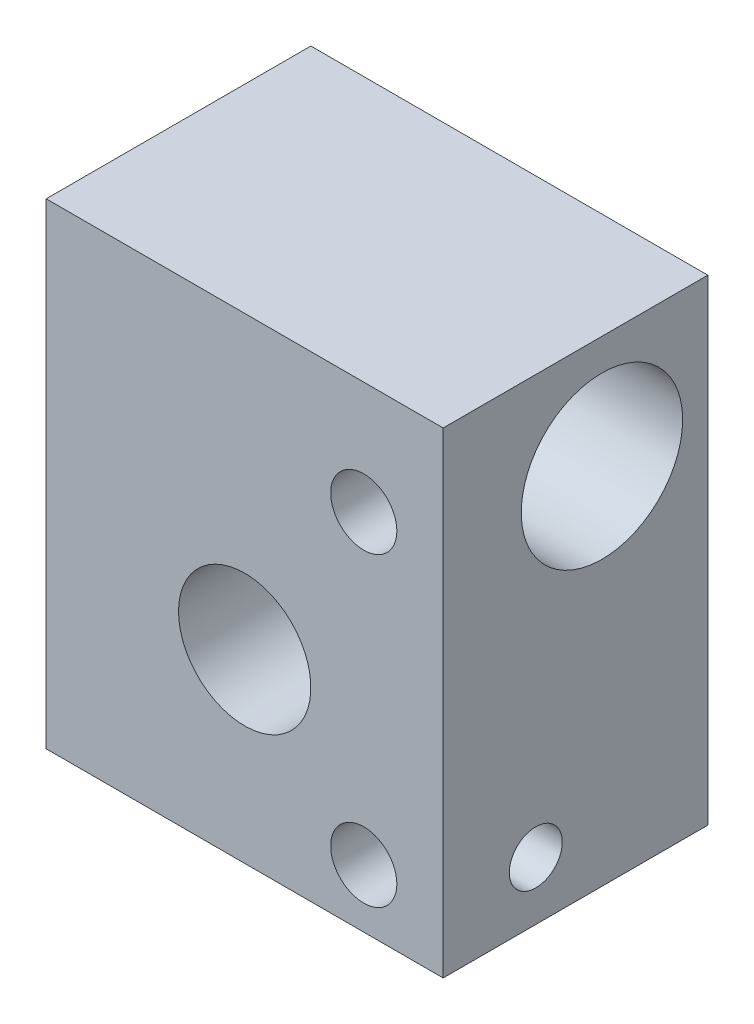
ISO-10303-21;
HEADER;
FILE_DESCRIPTION(('STEP AP214'),'2;1');
FILE_NAME('part.step','',(''),(''),'','','');
FILE_SCHEMA(('AUTOMOTIVE_DESIGN { 1 0 10303 214 1 1 1 1 }'));
ENDSEC;
DATA;
#1=APPLICATION_CONTEXT('core data for automotive mechanical design processes');
#2=APPLICATION_PROTOCOL_DEFINITION('international standard','automotive_design',2000,#1);
#3=PRODUCT_CONTEXT('',#1,'mechanical');
#4=PRODUCT('Part','Part','',(#3));
#5=PRODUCT_RELATED_PRODUCT_CATEGORY('part','',(#4));
#6=PRODUCT_DEFINITION_FORMATION('','',#4);
#7=PRODUCT_DEFINITION_CONTEXT('part definition',#1,'design');
#8=PRODUCT_DEFINITION('design','',#6,#7);
#9=PRODUCT_DEFINITION_SHAPE('','',#8);
#10=(LENGTH_UNIT() NAMED_UNIT(*) SI_UNIT(.MILLI.,.METRE.));
#11=(NAMED_UNIT(*) PLANE_ANGLE_UNIT() SI_UNIT($,.RADIAN.));
#12=(NAMED_UNIT(*) SI_UNIT($,.STERADIAN.) SOLID_ANGLE_UNIT());
#13=UNCERTAINTY_MEASURE_WITH_UNIT(LENGTH_MEASURE(1.E-05),#10,'distance_accuracy_value','');
#14=(GEOMETRIC_REPRESENTATION_CONTEXT(3) GLOBAL_UNCERTAINTY_ASSIGNED_CONTEXT((#13)) GLOBAL_UNIT_ASSIGNED_CONTEXT((#10,
#11,#12)) REPRESENTATION_CONTEXT('',''));
#15=CARTESIAN_POINT('',(0.,0.,0.));
#16=DIRECTION('',(0.,0.,1.));
#17=DIRECTION('',(1.,0.,0.));
#18=AXIS2_PLACEMENT_3D('',#15,#16,#17);
#19=CARTESIAN_POINT('',(7.5,-9.,10.));
#20=DIRECTION('',(-1.,0.,0.));
#21=DIRECTION('',(0.,0.,1.));
#22=AXIS2_PLACEMENT_3D('',#19,#20,#21);
#23=PLANE('',#22);
#24=CARTESIAN_POINT('',(7.5,-6.8,6.5));
#25=DIRECTION('',(1.,0.,0.));
#26=DIRECTION('',(0.,0.,-1.));
#27=AXIS2_PLACEMENT_3D('',#24,#25,#26);
#28=CIRCLE('',#27,0.999999999999998);
#29=CARTESIAN_POINT('',(7.5,-6.8,5.5));
#30=VERTEX_POINT('',#29);
#31=EDGE_CURVE('E122',#30,#30,#28,.T.);
#32=ORIENTED_EDGE('',*,*,#31,.F.);
#33=EDGE_LOOP('',(#32));
#34=FACE_BOUND('',#33,.T.);
#35=CARTESIAN_POINT('',(7.5,4.75,4.));
#36=DIRECTION('',(1.,0.,0.));
#37=DIRECTION('',(0.,0.,-1.));
#38=AXIS2_PLACEMENT_3D('',#35,#36,#37);
#39=CIRCLE('',#38,3.05);
#40=CARTESIAN_POINT('',(7.5,4.75,0.950000000000001));
#41=VERTEX_POINT('',#40);
#42=EDGE_CURVE('E243',#41,#41,#39,.T.);
#43=ORIENTED_EDGE('',*,*,#42,.F.);
#44=EDGE_LOOP('',(#43));
#45=FACE_BOUND('',#44,.T.);
#46=DIRECTION('',(0.,1.,0.));
#47=VECTOR('',#46,1.);
#48=CARTESIAN_POINT('',(7.5,-9.,0.));
#49=LINE('',#48,#47);
#50=CARTESIAN_POINT('',(7.5,-9.,0.));
#51=VERTEX_POINT('',#50);
#52=CARTESIAN_POINT('',(7.5,9.,0.));
#53=VERTEX_POINT('',#52);
#54=EDGE_CURVE('E204',#51,#53,#49,.T.);
#55=ORIENTED_EDGE('',*,*,#54,.T.);
#56=DIRECTION('',(0.,0.,-1.));
#57=VECTOR('',#56,1.);
#58=CARTESIAN_POINT('',(7.5,9.,10.));
#59=LINE('',#58,#57);
#60=CARTESIAN_POINT('',(7.5,9.,10.));
#61=VERTEX_POINT('',#60);
#62=EDGE_CURVE('E150',#61,#53,#59,.T.);
#63=ORIENTED_EDGE('',*,*,#62,.F.);
#64=DIRECTION('',(0.,1.,0.));
#65=VECTOR('',#64,1.);
#66=CARTESIAN_POINT('',(7.5,-9.,10.));
#67=LINE('',#66,#65);
#68=CARTESIAN_POINT('',(7.5,-9.,10.));
#69=VERTEX_POINT('',#68);
#70=EDGE_CURVE('E215',#69,#61,#67,.T.);
#71=ORIENTED_EDGE('',*,*,#70,.F.);
#72=DIRECTION('',(0.,0.,-1.));
#73=VECTOR('',#72,1.);
#74=CARTESIAN_POINT('',(7.5,-9.,10.));
#75=LINE('',#74,#73);
#76=EDGE_CURVE('E219',#69,#51,#75,.T.);
#77=ORIENTED_EDGE('',*,*,#76,.T.);
#78=EDGE_LOOP('',(#55,#63,#71,#77));
#79=FACE_BOUND('',#78,.T.);
#80=ADVANCED_FACE('F52',(#34,#45,#79),#23,.F.);
#81=CARTESIAN_POINT('',(-7.5,9.,10.));
#82=DIRECTION('',(0.,-1.,0.));
#83=DIRECTION('',(0.,0.,-1.));
#84=AXIS2_PLACEMENT_3D('',#81,#82,#83);
#85=PLANE('',#84);
#86=DIRECTION('',(-1.,0.,0.));
#87=VECTOR('',#86,1.);
#88=CARTESIAN_POINT('',(-7.5,9.,0.));
#89=LINE('',#88,#87);
#90=CARTESIAN_POINT('',(-7.5,9.,0.));
#91=VERTEX_POINT('',#90);
#92=EDGE_CURVE('E194',#53,#91,#89,.T.);
#93=ORIENTED_EDGE('',*,*,#92,.T.);
#94=DIRECTION('',(0.,0.,-1.));
#95=VECTOR('',#94,1.);
#96=CARTESIAN_POINT('',(-7.5,9.,10.));
#97=LINE('',#96,#95);
#98=CARTESIAN_POINT('',(-7.5,9.,10.));
#99=VERTEX_POINT('',#98);
#100=EDGE_CURVE('E196',#99,#91,#97,.T.);
#101=ORIENTED_EDGE('',*,*,#100,.F.);
#102=DIRECTION('',(-1.,0.,0.));
#103=VECTOR('',#102,1.);
#104=CARTESIAN_POINT('',(-7.5,9.,10.));
#105=LINE('',#104,#103);
#106=EDGE_CURVE('E229',#61,#99,#105,.T.);
#107=ORIENTED_EDGE('',*,*,#106,.F.);
#108=ORIENTED_EDGE('',*,*,#62,.T.);
#109=EDGE_LOOP('',(#93,#101,#107,#108));
#110=FACE_BOUND('',#109,.T.);
#111=ADVANCED_FACE('F184',(#110),#85,.F.);
#112=CARTESIAN_POINT('',(-7.5,-9.,10.));
#113=DIRECTION('',(1.,0.,0.));
#114=DIRECTION('',(0.,0.,-1.));
#115=AXIS2_PLACEMENT_3D('',#112,#113,#114);
#116=PLANE('',#115);
#117=CARTESIAN_POINT('',(-7.5,4.75,4.));
#118=DIRECTION('',(1.,0.,0.));
#119=DIRECTION('',(0.,0.,-1.));
#120=AXIS2_PLACEMENT_3D('',#117,#118,#119);
#121=CIRCLE('',#120,3.05);
#122=CARTESIAN_POINT('',(-7.5,4.75,0.950000000000001));
#123=VERTEX_POINT('',#122);
#124=EDGE_CURVE('E240',#123,#123,#121,.T.);
#125=ORIENTED_EDGE('',*,*,#124,.T.);
#126=EDGE_LOOP('',(#125));
#127=FACE_BOUND('',#126,.T.);
#128=DIRECTION('',(0.,-1.,0.));
#129=VECTOR('',#128,1.);
#130=CARTESIAN_POINT('',(-7.5,-9.,0.));
#131=LINE('',#130,#129);
#132=CARTESIAN_POINT('',(-7.5,-9.,0.));
#133=VERTEX_POINT('',#132);
#134=EDGE_CURVE('E203',#91,#133,#131,.T.);
#135=ORIENTED_EDGE('',*,*,#134,.T.);
#136=DIRECTION('',(0.,0.,-1.));
#137=VECTOR('',#136,1.);
#138=CARTESIAN_POINT('',(-7.5,-9.,10.));
#139=LINE('',#138,#137);
#140=CARTESIAN_POINT('',(-7.5,-9.,10.));
#141=VERTEX_POINT('',#140);
#142=EDGE_CURVE('E210',#141,#133,#139,.T.);
#143=ORIENTED_EDGE('',*,*,#142,.F.);
#144=DIRECTION('',(0.,-1.,0.));
#145=VECTOR('',#144,1.);
#146=CARTESIAN_POINT('',(-7.5,-9.,10.));
#147=LINE('',#146,#145);
#148=EDGE_CURVE('E209',#99,#141,#147,.T.);
#149=ORIENTED_EDGE('',*,*,#148,.F.);
#150=ORIENTED_EDGE('',*,*,#100,.T.);
#151=EDGE_LOOP('',(#135,#143,#149,#150));
#152=FACE_BOUND('',#151,.T.);
#153=ADVANCED_FACE('F181',(#127,#152),#116,.F.);
#154=CARTESIAN_POINT('',(-7.5,-9.,10.));
#155=DIRECTION('',(0.,1.,0.));
#156=DIRECTION('',(0.,0.,1.));
#157=AXIS2_PLACEMENT_3D('',#154,#155,#156);
#158=PLANE('',#157);
#159=DIRECTION('',(1.,0.,0.));
#160=VECTOR('',#159,1.);
#161=CARTESIAN_POINT('',(-7.5,-9.,0.));
#162=LINE('',#161,#160);
#163=EDGE_CURVE('E213',#133,#51,#162,.T.);
#164=ORIENTED_EDGE('',*,*,#163,.T.);
#165=ORIENTED_EDGE('',*,*,#76,.F.);
#166=DIRECTION('',(1.,0.,0.));
#167=VECTOR('',#166,1.);
#168=CARTESIAN_POINT('',(-7.5,-9.,10.));
#169=LINE('',#168,#167);
#170=EDGE_CURVE('E222',#141,#69,#169,.T.);
#171=ORIENTED_EDGE('',*,*,#170,.F.);
#172=ORIENTED_EDGE('',*,*,#142,.T.);
#173=EDGE_LOOP('',(#164,#165,#171,#172));
#174=FACE_BOUND('',#173,.T.);
#175=ADVANCED_FACE('F174',(#174),#158,.F.);
#176=CARTESIAN_POINT('',(0.,0.,10.));
#177=DIRECTION('',(0.,0.,-1.));
#178=DIRECTION('',(-1.,0.,0.));
#179=AXIS2_PLACEMENT_3D('',#176,#177,#178);
#180=PLANE('',#179);
#181=CARTESIAN_POINT('',(4.5,4.75,10.));
#182=DIRECTION('',(0.,0.,1.));
#183=DIRECTION('',(1.,0.,0.));
#184=AXIS2_PLACEMENT_3D('',#181,#182,#183);
#185=CIRCLE('',#184,1.24999999999999);
#186=CARTESIAN_POINT('',(5.74999999999999,4.75,10.));
#187=VERTEX_POINT('',#186);
#188=EDGE_CURVE('E255',#187,#187,#185,.T.);
#189=ORIENTED_EDGE('',*,*,#188,.F.);
#190=EDGE_LOOP('',(#189));
#191=FACE_BOUND('',#190,.T.);
#192=CARTESIAN_POINT('',(4.5,-6.8,10.));
#193=DIRECTION('',(0.,0.,1.));
#194=DIRECTION('',(1.,0.,0.));
#195=AXIS2_PLACEMENT_3D('',#192,#193,#194);
#196=CIRCLE('',#195,1.24999999999999);
#197=CARTESIAN_POINT('',(5.74999999999999,-6.8,10.));
#198=VERTEX_POINT('',#197);
#199=EDGE_CURVE('E253',#198,#198,#196,.T.);
#200=ORIENTED_EDGE('',*,*,#199,.F.);
#201=EDGE_LOOP('',(#200));
#202=FACE_BOUND('',#201,.T.);
#203=CARTESIAN_POINT('',(0.,-2.,10.));
#204=DIRECTION('',(0.,0.,-1.));
#205=DIRECTION('',(-1.,0.,0.));
#206=AXIS2_PLACEMENT_3D('',#203,#204,#205);
#207=CIRCLE('',#206,2.5);
#208=CARTESIAN_POINT('',(-2.5,-2.,10.));
#209=VERTEX_POINT('',#208);
#210=EDGE_CURVE('E232',#209,#209,#207,.T.);
#211=ORIENTED_EDGE('',*,*,#210,.T.);
#212=EDGE_LOOP('',(#211));
#213=FACE_BOUND('',#212,.T.);
#214=ORIENTED_EDGE('',*,*,#70,.T.);
#215=ORIENTED_EDGE('',*,*,#106,.T.);
#216=ORIENTED_EDGE('',*,*,#148,.T.);
#217=ORIENTED_EDGE('',*,*,#170,.T.);
#218=EDGE_LOOP('',(#214,#215,#216,#217));
#219=FACE_BOUND('',#218,.T.);
#220=ADVANCED_FACE('F171',(#191,#202,#213,#219),#180,.F.);
#221=CARTESIAN_POINT('',(0.,0.,0.));
#222=DIRECTION('',(0.,0.,-1.));
#223=DIRECTION('',(-1.,0.,0.));
#224=AXIS2_PLACEMENT_3D('',#221,#222,#223);
#225=PLANE('',#224);
#226=CARTESIAN_POINT('',(0.,-2.,0.));
#227=DIRECTION('',(0.,0.,-1.));
#228=DIRECTION('',(-1.,0.,0.));
#229=AXIS2_PLACEMENT_3D('',#226,#227,#228);
#230=CIRCLE('',#229,2.5);
#231=CARTESIAN_POINT('',(-2.5,-2.,0.));
#232=VERTEX_POINT('',#231);
#233=EDGE_CURVE('E235',#232,#232,#230,.T.);
#234=ORIENTED_EDGE('',*,*,#233,.F.);
#235=EDGE_LOOP('',(#234));
#236=FACE_BOUND('',#235,.T.);
#237=ORIENTED_EDGE('',*,*,#54,.F.);
#238=ORIENTED_EDGE('',*,*,#163,.F.);
#239=ORIENTED_EDGE('',*,*,#134,.F.);
#240=ORIENTED_EDGE('',*,*,#92,.F.);
#241=EDGE_LOOP('',(#237,#238,#239,#240));
#242=FACE_BOUND('',#241,.T.);
#243=ADVANCED_FACE('F169',(#236,#242),#225,.T.);
#244=CARTESIAN_POINT('',(0.,-2.,10.));
#245=DIRECTION('',(0.,0.,-1.));
#246=DIRECTION('',(-1.,0.,0.));
#247=AXIS2_PLACEMENT_3D('',#244,#245,#246);
#248=CYLINDRICAL_SURFACE('',#247,2.5);
#249=ORIENTED_EDGE('',*,*,#210,.F.);
#250=EDGE_LOOP('',(#249));
#251=FACE_BOUND('',#250,.T.);
#252=ORIENTED_EDGE('',*,*,#233,.T.);
#253=EDGE_LOOP('',(#252));
#254=FACE_BOUND('',#253,.T.);
#255=ADVANCED_FACE('F165',(#251,#254),#248,.F.);
#256=CARTESIAN_POINT('',(-7.5,4.75,4.));
#257=DIRECTION('',(1.,0.,0.));
#258=DIRECTION('',(0.,0.,-1.));
#259=AXIS2_PLACEMENT_3D('',#256,#257,#258);
#260=CYLINDRICAL_SURFACE('',#259,3.05);
#261=CARTESIAN_POINT('',(5.74999999999999,4.75,7.05));
#262=CARTESIAN_POINT('',(5.74999317358084,4.81705105449435,7.0499949013604));
#263=CARTESIAN_POINT('',(5.7445728904159,4.88421220939516,7.04776316601173));
#264=CARTESIAN_POINT('',(5.7230821427269,5.01663531512961,7.03905220749816));
#265=CARTESIAN_POINT('',(5.7069833965083,5.08189174087961,7.0325617055695));
#266=CARTESIAN_POINT('',(5.66482596800735,5.20837429284752,7.01603149034563));
#267=CARTESIAN_POINT('',(5.63880056530878,5.2696130929358,7.00600364451595));
#268=CARTESIAN_POINT('',(5.57766372514542,5.38679775394015,6.98337979201622));
#269=CARTESIAN_POINT('',(5.54255520538643,5.44274530666015,6.97078461030852));
#270=CARTESIAN_POINT('',(5.46243359833868,5.55058268229026,6.94360272183732));
#271=CARTESIAN_POINT('',(5.41704813784625,5.60217961883631,6.92895218720805));
#272=CARTESIAN_POINT('',(5.31844769395315,5.69727980579278,6.8995935820288));
#273=CARTESIAN_POINT('',(5.26522873562099,5.74077892161812,6.88488548598071));
#274=CARTESIAN_POINT('',(5.1494220879687,5.82047635819198,6.85630174305004));
#275=CARTESIAN_POINT('',(5.08651058665788,5.85623272255294,6.84249824263373));
#276=CARTESIAN_POINT('',(4.95491722684178,5.91652509902148,6.81829427065235));
#277=CARTESIAN_POINT('',(4.88623826542879,5.9410667050528,6.80789210323986));
#278=CARTESIAN_POINT('',(4.74842884283273,5.977033698322,6.79235707938262));
#279=CARTESIAN_POINT('',(4.67947149284317,5.98902161527503,6.78699943260884));
#280=CARTESIAN_POINT('',(4.54033187566907,6.00129693566521,6.78151145539133));
#281=CARTESIAN_POINT('',(4.47015027248522,6.00159049579919,6.78137837438494));
#282=CARTESIAN_POINT('',(4.33607409840986,5.99089353762405,6.78616368996563));
#283=CARTESIAN_POINT('',(4.27209740726591,5.98073314256808,6.79071047916049));
#284=CARTESIAN_POINT('',(4.14685271703793,5.95080567936669,6.80371701324258));
#285=CARTESIAN_POINT('',(4.08558521945647,5.93103684064336,6.81217747930138));
#286=CARTESIAN_POINT('',(3.96597856734735,5.88207159424284,6.83224715740189));
#287=CARTESIAN_POINT('',(3.90772757534972,5.85268647565431,6.84391858333761));
#288=CARTESIAN_POINT('',(3.79676189319712,5.78545581744839,6.8690795378448));
#289=CARTESIAN_POINT('',(3.74404935655718,5.7476070046597,6.88256976900067));
#290=CARTESIAN_POINT('',(3.64113506271575,5.66089979031177,6.91118669367846));
#291=CARTESIAN_POINT('',(3.59148817119212,5.61139546177047,6.92635714795841));
#292=CARTESIAN_POINT('',(3.50101833818234,5.50460843164101,6.95569448523891));
#293=CARTESIAN_POINT('',(3.46019733238115,5.44732402821036,6.96986114763168));
#294=CARTESIAN_POINT('',(3.38776019476994,5.32496342854657,6.99598214323011));
#295=CARTESIAN_POINT('',(3.35636271935724,5.25974527572702,7.00788187819974));
#296=CARTESIAN_POINT('',(3.30517803112997,5.12434088842293,7.02771185130719));
#297=CARTESIAN_POINT('',(3.28538461664024,5.05415733016857,7.03564420943661));
#298=CARTESIAN_POINT('',(3.25911499785756,4.91545720041041,7.04625363825052));
#299=CARTESIAN_POINT('',(3.25189372784432,4.84710415103708,7.04922426910946));
#300=CARTESIAN_POINT('',(3.24876092149755,4.71010441371817,7.0505074612745));
#301=CARTESIAN_POINT('',(3.25284627086616,4.64145781182913,7.04882130524732));
#302=CARTESIAN_POINT('',(3.27167121733155,4.50926209998629,7.04117156509262));
#303=CARTESIAN_POINT('',(3.28589367478943,4.44562598291882,7.03541570476584));
#304=CARTESIAN_POINT('',(3.32387605471634,4.32170816248345,7.02042451329165));
#305=CARTESIAN_POINT('',(3.34763719121059,4.26142688721188,7.01118873925112));
#306=CARTESIAN_POINT('',(3.40479928404273,4.14383011012163,6.98977295322551));
#307=CARTESIAN_POINT('',(3.43847544195124,4.08666382302296,6.97751077732146));
#308=CARTESIAN_POINT('',(3.51420811639302,3.97859041874229,6.95135965585715));
#309=CARTESIAN_POINT('',(3.55626807827196,3.92768588879936,6.93747004246777));
#310=CARTESIAN_POINT('',(3.65098440399942,3.82987991098666,6.9083776173988));
#311=CARTESIAN_POINT('',(3.70417275944046,3.78349954211682,6.89315046142814));
#312=CARTESIAN_POINT('',(3.81783195761042,3.70018452435906,6.86397295744693));
#313=CARTESIAN_POINT('',(3.87830425548019,3.66325176747518,6.85002286554325));
#314=CARTESIAN_POINT('',(4.00591935720062,3.59955272757804,6.82491824303052));
#315=CARTESIAN_POINT('',(4.0731350035576,3.57291696039833,6.8138001745101));
#316=CARTESIAN_POINT('',(4.21169404128461,3.53156002386075,6.79614362783963));
#317=CARTESIAN_POINT('',(4.28303413036749,3.51682946022231,6.78960153937764));
#318=CARTESIAN_POINT('',(4.42205571719578,3.50061997017984,6.78237686582237));
#319=CARTESIAN_POINT('',(4.48961071540186,3.49823064874135,6.78129189039514));
#320=CARTESIAN_POINT('',(4.62411541510115,3.50435741732201,6.78404131006805));
#321=CARTESIAN_POINT('',(4.6910652011546,3.51287195937366,6.7878750068888));
#322=CARTESIAN_POINT('',(4.8194595845332,3.53980857539514,6.79966724973414));
#323=CARTESIAN_POINT('',(4.88101694579431,3.55778270632242,6.80743875303861));
#324=CARTESIAN_POINT('',(5.00026093044537,3.60269826055876,6.82609039777681));
#325=CARTESIAN_POINT('',(5.0579464682445,3.62964218632339,6.83697140660187));
#326=CARTESIAN_POINT('',(5.17152052867124,3.69356546820026,6.86141244323642));
#327=CARTESIAN_POINT('',(5.22710231558399,3.73104304994741,6.87509264152988));
#328=CARTESIAN_POINT('',(5.33147333634056,3.81425954659735,6.90324259102355));
#329=CARTESIAN_POINT('',(5.38026033074679,3.8600011738197,6.91771260035406));
#330=CARTESIAN_POINT('',(5.47314082024466,3.96222488066987,6.94701985281455));
#331=CARTESIAN_POINT('',(5.51667265144533,4.0192324065468,6.961812751821));
#332=CARTESIAN_POINT('',(5.59357367951555,4.14029737005191,6.98908126299053));
#333=CARTESIAN_POINT('',(5.6269382146159,4.20435802331352,7.00155581115557));
#334=CARTESIAN_POINT('',(5.68180811191665,4.33663629870453,7.02258806460315));
#335=CARTESIAN_POINT('',(5.70351052450805,4.40476171520484,7.03121040731175));
#336=CARTESIAN_POINT('',(5.73495872650017,4.54399616753341,7.04383134859934));
#337=CARTESIAN_POINT('',(5.74474216568277,4.61509507070934,7.04784450441534));
#338=CARTESIAN_POINT('',(5.74946289651355,4.70760124338892,7.04978053015449));
#339=CARTESIAN_POINT('',(5.75000215885384,4.72879511590617,7.05000161244387));
#340=CARTESIAN_POINT('',(5.74999999999999,4.75,7.05));
#341=B_SPLINE_CURVE_WITH_KNOTS('',3,(#261,#262,#263,#264,#265,#266,#267,#268,#269,#270,#271,
#272,#273,#274,#275,#276,#277,#278,#279,#280,#281,#282,#283,#284,#285,#286,#287,#288,#289,#290,
#291,#292,#293,#294,#295,#296,#297,#298,#299,#300,#301,#302,#303,#304,#305,#306,#307,#308,#309,
#310,#311,#312,#313,#314,#315,#316,#317,#318,#319,#320,#321,#322,#323,#324,#325,#326,#327,#328,
#329,#330,#331,#332,#333,#334,#335,#336,#337,#338,#339,#340),.UNSPECIFIED.,.T.,.F.,(4,2,2,2,2,2,
2,2,2,2,2,2,2,2,2,2,2,2,2,2,2,2,2,2,2,2,2,2,2,2,2,2,2,2,2,2,2,2,2,4),(0.,0.201094311180327,
0.402723354574274,0.60368228554281,0.804576743863707,1.01444492091329,1.22441996030868,
1.44431409976959,1.66409843594336,1.87354721803841,2.08288573073389,2.27679448285735,
2.47073898070664,2.66874390795883,2.86682554265503,3.08105274490332,3.29532688370776,
3.51424468844056,3.73304538781654,3.93837132545348,4.14364071369572,4.33912550528581,
4.53463518488672,4.73618655641969,4.93782092740471,5.15341391236424,5.36905003881043,
5.58733616568886,5.80544987646513,6.00721727204662,6.20895602688514,6.40190297186301,
6.59490379169176,6.79928960640031,7.00374262427848,7.22240178249367,7.44116104698124,
7.65609749208749,7.87035321839582,7.93394925864703),.UNSPECIFIED.);
#342=CARTESIAN_POINT('',(5.74999999999999,4.75,7.05));
#343=VERTEX_POINT('',#342);
#344=EDGE_CURVE('E151',#343,#343,#341,.T.);
#345=ORIENTED_EDGE('',*,*,#344,.T.);
#346=EDGE_LOOP('',(#345));
#347=FACE_BOUND('',#346,.T.);
#348=ORIENTED_EDGE('',*,*,#124,.F.);
#349=EDGE_LOOP('',(#348));
#350=FACE_BOUND('',#349,.T.);
#351=ORIENTED_EDGE('',*,*,#42,.T.);
#352=EDGE_LOOP('',(#351));
#353=FACE_BOUND('',#352,.T.);
#354=ADVANCED_FACE('F159',(#347,#350,#353),#260,.F.);
#355=CARTESIAN_POINT('',(4.5,-6.8,6.));
#356=DIRECTION('',(0.,0.,1.));
#357=DIRECTION('',(1.,0.,0.));
#358=AXIS2_PLACEMENT_3D('',#355,#356,#357);
#359=CONICAL_SURFACE('',#358,1.25,1.02974425867665);
#360=CARTESIAN_POINT('',(4.5,-6.8,5.24892422621555));
#361=VERTEX_POINT('',#360);
#362=VERTEX_LOOP('',#361);
#363=FACE_BOUND('',#362,.T.);
#364=CARTESIAN_POINT('',(4.5,-6.8,6.));
#365=DIRECTION('',(0.,0.,1.));
#366=DIRECTION('',(1.,0.,0.));
#367=AXIS2_PLACEMENT_3D('',#364,#365,#366);
#368=CIRCLE('',#367,1.25);
#369=CARTESIAN_POINT('',(3.598612181134,-7.66602540378443,6.));
#370=VERTEX_POINT('',#369);
#371=CARTESIAN_POINT('',(5.40138781886869,-7.66602540378681,6.00000000000196));
#372=VERTEX_POINT('',#371);
#373=EDGE_CURVE('E252',#370,#372,#368,.T.);
#374=ORIENTED_EDGE('',*,*,#373,.T.);
#375=CARTESIAN_POINT('',(5.49028641707355,-7.69312930754734,6.0502));
#376=CARTESIAN_POINT('',(5.4620540291597,-7.68516229364402,6.03439446403427));
#377=CARTESIAN_POINT('',(5.43397441822092,-7.67667040293627,6.01856440625544));
#378=CARTESIAN_POINT('',(5.37820933805071,-7.65846567832842,5.98679857880335));
#379=CARTESIAN_POINT('',(5.35052460000254,-7.64875084220868,5.97086267732073));
#380=CARTESIAN_POINT('',(5.29534164443274,-7.62780610981277,5.93865263805377));
#381=CARTESIAN_POINT('',(5.26785172041543,-7.6165565790724,5.92237691803523));
#382=CARTESIAN_POINT('',(5.21372068820972,-7.59240944996764,5.88967177107602));
#383=CARTESIAN_POINT('',(5.18707899740181,-7.5795130147024,5.87324246012328));
#384=CARTESIAN_POINT('',(5.13220243909832,-7.55021227801001,5.83836852135706));
#385=CARTESIAN_POINT('',(5.10410431543777,-7.53357989189848,5.8198971567474));
#386=CARTESIAN_POINT('',(5.05034517125699,-7.49710879666876,5.78255861572174));
#387=CARTESIAN_POINT('',(5.02467984624535,-7.47727592504741,5.76369221334503));
#388=CARTESIAN_POINT('',(4.98483989175455,-7.43999201796968,5.73135380836441));
#389=CARTESIAN_POINT('',(4.96954941989286,-7.4236625107789,5.71799347162254));
#390=CARTESIAN_POINT('',(4.94218478884379,-7.38857975994309,5.6912618305678));
#391=CARTESIAN_POINT('',(4.93009685493828,-7.36983742938766,5.67789082979815));
#392=CARTESIAN_POINT('',(4.91016740799821,-7.329590146974,5.65140304199133));
#393=CARTESIAN_POINT('',(4.90238168548031,-7.3080531773224,5.63829162851512));
#394=CARTESIAN_POINT('',(4.89169708291768,-7.26309379111954,5.61331666161574));
#395=CARTESIAN_POINT('',(4.88881009238113,-7.23966693149489,5.60145620952708));
#396=CARTESIAN_POINT('',(4.88623771053257,-7.18102854252964,5.57464593497841));
#397=CARTESIAN_POINT('',(4.8886037228914,-7.14530002689939,5.56074189203022));
#398=CARTESIAN_POINT('',(4.89581292295022,-7.07266926803107,5.53712400838137));
#399=CARTESIAN_POINT('',(4.90066989969421,-7.03576157518701,5.52743405299092));
#400=CARTESIAN_POINT('',(4.91006860539325,-6.95380542606474,5.51086100553405));
#401=CARTESIAN_POINT('',(4.91437678220478,-6.90853802728334,5.50485597158092));
#402=CARTESIAN_POINT('',(4.9184748067492,-6.81754799344687,5.49912238604378));
#403=CARTESIAN_POINT('',(4.91828328292789,-6.77182801826922,5.49936795774198));
#404=CARTESIAN_POINT('',(4.91341881342609,-6.67863261058294,5.50622854677725));
#405=CARTESIAN_POINT('',(4.90849830019974,-6.63120016203335,5.51319551359828));
#406=CARTESIAN_POINT('',(4.8974167784806,-6.53776947303589,5.53380349357297));
#407=CARTESIAN_POINT('',(4.89125185371857,-6.4917763035517,5.54746577626934));
#408=CARTESIAN_POINT('',(4.88715963497418,-6.42244524242514,5.57365031385066));
#409=CARTESIAN_POINT('',(4.88674774685179,-6.39841640858867,5.58380701297793));
#410=CARTESIAN_POINT('',(4.88976593975288,-6.3515349652331,5.60582909571334));
#411=CARTESIAN_POINT('',(4.89316735273016,-6.32867491195563,5.61768115280812));
#412=CARTESIAN_POINT('',(4.90481955461782,-6.28460383870021,5.642669092288));
#413=CARTESIAN_POINT('',(4.91312257269359,-6.26341340810177,5.65581751190304));
#414=CARTESIAN_POINT('',(4.93411194219538,-6.22351706477168,5.68253382279197));
#415=CARTESIAN_POINT('',(4.94682115498955,-6.20482482880032,5.69610355897556));
#416=CARTESIAN_POINT('',(4.98149614630583,-6.16232995685965,5.72903491275924));
#417=CARTESIAN_POINT('',(5.00508221426013,-6.13985006830772,5.74834355388397));
#418=CARTESIAN_POINT('',(5.05581374943648,-6.09868488061901,5.78659230699454));
#419=CARTESIAN_POINT('',(5.08298397356535,-6.08002851866166,5.80552869364956));
#420=CARTESIAN_POINT('',(5.14072146790836,-6.04479770679221,5.84396632214518));
#421=CARTESIAN_POINT('',(5.1713904277386,-6.02837263772575,5.86344892060987));
#422=CARTESIAN_POINT('',(5.23412643971758,-5.99799989181846,5.90217002760717));
#423=CARTESIAN_POINT('',(5.26619554023356,-5.98405600718381,5.92140812147574));
#424=CARTESIAN_POINT('',(5.3300143351173,-5.95868810757523,5.95899211536545));
#425=CARTESIAN_POINT('',(5.36173093611331,-5.94718922450714,5.97734442596747));
#426=CARTESIAN_POINT('',(5.4256642289682,-5.92585951930255,6.0138744249624));
#427=CARTESIAN_POINT('',(5.45787881496915,-5.91602307251018,6.03205249756596));
#428=CARTESIAN_POINT('',(5.49028641707356,-5.90687069245265,6.05019999999999));
#429=B_SPLINE_CURVE_WITH_KNOTS('',3,(#375,#376,#377,#378,#379,#380,#381,#382,#383,#384,#385,
#386,#387,#388,#389,#390,#391,#392,#393,#394,#395,#396,#397,#398,#399,#400,#401,#402,#403,#404,
#405,#406,#407,#408,#409,#410,#411,#412,#413,#414,#415,#416,#417,#418,#419,#420,#421,#422,#423,
#424,#425,#426,#427,#428),.UNSPECIFIED.,.F.,.F.,(4,2,2,2,2,2,2,2,2,2,2,2,2,2,2,2,2,2,2,2,2,2,2,
2,2,2,4),(0.,0.0999728954722889,0.200111649914622,0.301678803220385,0.403174619034599,
0.515584481665867,0.627791585764168,0.705740491157839,0.783348470749543,0.861940559971286,
0.940723125374583,1.05531115599276,1.17054046158092,1.30757349647233,1.44403932453253,
1.58806182841255,1.73254485532535,1.81057795926005,1.88802832841069,1.96631925883886,
2.04502263303189,2.15802352730949,2.27185038942399,2.39132944073084,2.51098956226303,
2.62616392516715,2.74094044998118),.UNSPECIFIED.);
#430=CARTESIAN_POINT('',(5.401387818866,-5.93397459621556,6.));
#431=VERTEX_POINT('',#430);
#432=EDGE_CURVE('E13',#372,#431,#429,.T.);
#433=ORIENTED_EDGE('',*,*,#432,.T.);
#434=CARTESIAN_POINT('',(3.59861218113131,-5.93397459621319,6.00000000000196));
#435=VERTEX_POINT('',#434);
#436=EDGE_CURVE('E247',#431,#435,#368,.T.);
#437=ORIENTED_EDGE('',*,*,#436,.T.);
#438=CARTESIAN_POINT('',(3.50971358292644,-5.90687069245266,6.0502));
#439=CARTESIAN_POINT('',(3.53331315066842,-5.91352483721161,6.03699153619936));
#440=CARTESIAN_POINT('',(3.5567997123455,-5.92055093156863,6.02376501618166));
#441=CARTESIAN_POINT('',(3.60349741941,-5.9354342598509,5.99724961432135));
#442=CARTESIAN_POINT('',(3.62670833949662,-5.943292127758,5.98396069239589));
#443=CARTESIAN_POINT('',(3.69717031261121,-5.96872321181211,5.94319816564678));
#444=CARTESIAN_POINT('',(3.7438358110887,-5.98776882275197,5.91561372999426));
#445=CARTESIAN_POINT('',(3.83471240297246,-6.03095640395233,5.85981688611285));
#446=CARTESIAN_POINT('',(3.87891676344681,-6.05511156272037,5.83160302516138));
#447=CARTESIAN_POINT('',(3.94083716089381,-6.09681482391588,5.78872178686289));
#448=CARTESIAN_POINT('',(3.96066329263914,-6.11154589536983,5.77440315102412));
#449=CARTESIAN_POINT('',(3.99813510882635,-6.14332035661841,5.74552415052808));
#450=CARTESIAN_POINT('',(4.01578567575378,-6.16035838166081,5.73096441352294));
#451=CARTESIAN_POINT('',(4.04652590778618,-6.19591099573206,5.70278607647913));
#452=CARTESIAN_POINT('',(4.05985910623184,-6.21421741426561,5.68917928098483));
#453=CARTESIAN_POINT('',(4.08226510274055,-6.2533626627292,5.66229859506211));
#454=CARTESIAN_POINT('',(4.09136422741643,-6.27418480156528,5.64902314678261));
#455=CARTESIAN_POINT('',(4.10464310673414,-6.31793974424823,5.62349687802884));
#456=CARTESIAN_POINT('',(4.10881781004169,-6.34087468940767,5.61124712162209));
#457=CARTESIAN_POINT('',(4.11306265600131,-6.38806657508964,5.58840380415463));
#458=CARTESIAN_POINT('',(4.11309881514464,-6.41233282411698,5.57782466777655));
#459=CARTESIAN_POINT('',(4.11081909538787,-6.46046097284519,5.55906713984957));
#460=CARTESIAN_POINT('',(4.10859993826292,-6.48429842321439,5.55080787372999));
#461=CARTESIAN_POINT('',(4.10335614543742,-6.53246306784323,5.5361231670742));
#462=CARTESIAN_POINT('',(4.1003306042383,-6.55679078406327,5.52969980500596));
#463=CARTESIAN_POINT('',(4.09451085196856,-6.60579562257214,5.51871894904032));
#464=CARTESIAN_POINT('',(4.09171580951763,-6.63047107603481,5.51415449234926));
#465=CARTESIAN_POINT('',(4.08702679450586,-6.68017771334998,5.50688722680716));
#466=CARTESIAN_POINT('',(4.08513254220297,-6.70520878427462,5.50418383988055));
#467=CARTESIAN_POINT('',(4.08254750308201,-6.75738125016416,5.5005412204046));
#468=CARTESIAN_POINT('',(4.08195889631627,-6.78453870485979,5.49975135089749));
#469=CARTESIAN_POINT('',(4.08241996599582,-6.83881884917334,5.50038504756375));
#470=CARTESIAN_POINT('',(4.08347004507912,-6.86594152860778,5.50180915772903));
#471=CARTESIAN_POINT('',(4.08697842937304,-6.92002793067094,5.5068557657891));
#472=CARTESIAN_POINT('',(4.0894441853843,-6.94699004361226,5.51048990123161));
#473=CARTESIAN_POINT('',(4.09516019310819,-7.00043858924834,5.51991792137252));
#474=CARTESIAN_POINT('',(4.09841040229522,-7.02692504764496,5.52571168900542));
#475=CARTESIAN_POINT('',(4.10519576081253,-7.08368196745147,5.54056108147484));
#476=CARTESIAN_POINT('',(4.10868992530325,-7.11385875777519,5.54999633842318));
#477=CARTESIAN_POINT('',(4.11285630884389,-7.17325822177271,5.57174106146463));
#478=CARTESIAN_POINT('',(4.11354654398704,-7.20248578590847,5.58403163962699));
#479=CARTESIAN_POINT('',(4.1096980334543,-7.25174952014176,5.60755661353824));
#480=CARTESIAN_POINT('',(4.10650824550244,-7.2721535088778,5.61819452914818));
#481=CARTESIAN_POINT('',(4.09631900767154,-7.31145889668883,5.64039608881511));
#482=CARTESIAN_POINT('',(4.08932129327637,-7.33036097577355,5.65195930911316));
#483=CARTESIAN_POINT('',(4.07187333548009,-7.36609999506259,5.67538611754454));
#484=CARTESIAN_POINT('',(4.06143983303491,-7.3829464164912,5.6872479966086));
#485=CARTESIAN_POINT('',(4.0379304302771,-7.41469361637308,5.71098474345566));
#486=CARTESIAN_POINT('',(4.02484833016169,-7.42958969221195,5.72285957546288));
#487=CARTESIAN_POINT('',(3.98245149583499,-7.47213854501448,5.75863019433972));
#488=CARTESIAN_POINT('',(3.95030629956501,-7.49711016597753,5.78229754158439));
#489=CARTESIAN_POINT('',(3.88231649195085,-7.54225642438731,5.82909749644401));
#490=CARTESIAN_POINT('',(3.84644852850505,-7.5623977869094,5.85222545652559));
#491=CARTESIAN_POINT('',(3.76145323607756,-7.60471990904869,5.90510677052084));
#492=CARTESIAN_POINT('',(3.71162145890342,-7.62564542244421,5.93472675232658));
#493=CARTESIAN_POINT('',(3.636071292196,-7.65346919608147,5.97858123510041));
#494=CARTESIAN_POINT('',(3.61102171575906,-7.66207715135555,5.9929551794052));
#495=CARTESIAN_POINT('',(3.56059863176369,-7.67831041892385,6.02162556712644));
#496=CARTESIAN_POINT('',(3.53522548724744,-7.68593674144481,6.03592207547788));
#497=CARTESIAN_POINT('',(3.50971358292644,-7.69312930754734,6.0502));
#498=B_SPLINE_CURVE_WITH_KNOTS('',3,(#438,#439,#440,#441,#442,#443,#444,#445,#446,#447,#448,
#449,#450,#451,#452,#453,#454,#455,#456,#457,#458,#459,#460,#461,#462,#463,#464,#465,#466,#467,
#468,#469,#470,#471,#472,#473,#474,#475,#476,#477,#478,#479,#480,#481,#482,#483,#484,#485,#486,
#487,#488,#489,#490,#491,#492,#493,#494,#495,#496,#497),.UNSPECIFIED.,.F.,.F.,(4,2,2,2,2,2,2,2,
2,2,2,2,2,2,2,2,2,2,2,2,2,2,2,2,2,2,2,2,2,4),(0.,0.0835520453506485,0.167168239405998,
0.339378728614747,0.512039264477075,0.597570075986015,0.682905298970882,0.761806801456588,
0.840210929777046,0.918695413123635,0.997824323169111,1.07369719179067,1.14965562058719,
1.22532686000053,1.30097458419883,1.38236014465604,1.46376570533486,1.54560368850048,
1.62743723618381,1.72272259273378,1.81739473431565,1.88674994840292,1.95607357990292,
2.02506430849321,2.09421843665384,2.23466803413924,2.37605903144819,2.5606240898532,
2.65102370647571,2.74132953346726),.UNSPECIFIED.);
#499=EDGE_CURVE('E64',#435,#370,#498,.T.);
#500=ORIENTED_EDGE('',*,*,#499,.T.);
#501=EDGE_LOOP('',(#374,#433,#437,#500));
#502=FACE_BOUND('',#501,.T.);
#503=ADVANCED_FACE('F156',(#363,#502),#359,.F.);
#504=CARTESIAN_POINT('',(4.5,-6.8,10.));
#505=DIRECTION('',(0.,0.,1.));
#506=DIRECTION('',(1.,0.,0.));
#507=AXIS2_PLACEMENT_3D('',#504,#505,#506);
#508=CYLINDRICAL_SURFACE('',#507,1.24999999999999);
#509=ORIENTED_EDGE('',*,*,#373,.F.);
#510=CARTESIAN_POINT('',(3.59861218113401,-7.66602540378443,6.));
#511=CARTESIAN_POINT('',(3.6184739762057,-7.68675902626416,6.03596487697014));
#512=CARTESIAN_POINT('',(3.63792426677372,-7.70550837472696,6.07356604043001));
#513=CARTESIAN_POINT('',(3.67420457060918,-7.73869615813151,6.15254086986226));
#514=CARTESIAN_POINT('',(3.69099237800154,-7.75306795614247,6.19396143451628));
#515=CARTESIAN_POINT('',(3.71662484017291,-7.774191046944,6.27147824029317));
#516=CARTESIAN_POINT('',(3.72638490183204,-7.78188898138144,6.30699782754954));
#517=CARTESIAN_POINT('',(3.74119250823732,-7.79337834014281,6.37944342339025));
#518=CARTESIAN_POINT('',(3.74626821333322,-7.7971931227873,6.41635962027606));
#519=CARTESIAN_POINT('',(3.75087623406768,-7.80066203387391,6.49104013185147));
#520=CARTESIAN_POINT('',(3.7503659702569,-7.80028420352463,6.52880876791995));
#521=CARTESIAN_POINT('',(3.74379868009988,-7.79532595045897,6.60363042555023));
#522=CARTESIAN_POINT('',(3.73772850144248,-7.79073556263663,6.64068153745415));
#523=CARTESIAN_POINT('',(3.71917407194171,-7.7762048970141,6.72156369670487));
#524=CARTESIAN_POINT('',(3.70551473903188,-7.7652582085766,6.76493288121588));
#525=CARTESIAN_POINT('',(3.67391866748519,-7.7383604281203,6.84844802500106));
#526=CARTESIAN_POINT('',(3.65597022712357,-7.72239560717476,6.88858475769217));
#527=CARTESIAN_POINT('',(3.60917119928421,-7.67771680229838,6.98318071024624));
#528=CARTESIAN_POINT('',(3.57907694975281,-7.64650740694967,7.03584310834097));
#529=CARTESIAN_POINT('',(3.5183559128812,-7.57529354321466,7.13452506969512));
#530=CARTESIAN_POINT('',(3.4877285307973,-7.53527858397908,7.18053659992188));
#531=CARTESIAN_POINT('',(3.42850448445096,-7.44599465399415,7.26586751507779));
#532=CARTESIAN_POINT('',(3.39994062620079,-7.3966085923144,7.30508869960434));
#533=CARTESIAN_POINT('',(3.34824880857564,-7.28936992436963,7.37439063704452));
#534=CARTESIAN_POINT('',(3.32510309630992,-7.23154600583372,7.40450133866137));
#535=CARTESIAN_POINT('',(3.29321706824316,-7.1287352289244,7.4454787311362));
#536=CARTESIAN_POINT('',(3.28223911477027,-7.08565789198627,7.45941959553146));
#537=CARTESIAN_POINT('',(3.2648228483799,-6.99714123564449,7.48143202454589));
#538=CARTESIAN_POINT('',(3.25838106982787,-6.95170374795623,7.48950807003057));
#539=CARTESIAN_POINT('',(3.25055997532031,-6.85954328009454,7.49930431849854));
#540=CARTESIAN_POINT('',(3.24919867951823,-6.81281631522798,7.50100189760592));
#541=CARTESIAN_POINT('',(3.25171166139105,-6.7197235050632,7.49786005964921));
#542=CARTESIAN_POINT('',(3.25558637936792,-6.67335769046427,7.49302009283597));
#543=CARTESIAN_POINT('',(3.26789644071195,-6.58478275906894,7.47754770761949));
#544=CARTESIAN_POINT('',(3.27608478095272,-6.54248278388333,7.46722878915105));
#545=CARTESIAN_POINT('',(3.29626920480038,-6.46041183970799,7.44155751906085));
#546=CARTESIAN_POINT('',(3.30826626745011,-6.42064152413306,7.42620387321483));
#547=CARTESIAN_POINT('',(3.33662734477677,-6.34061610275749,7.38943026475194));
#548=CARTESIAN_POINT('',(3.3532975400543,-6.30067249548245,7.36757318159561));
#549=CARTESIAN_POINT('',(3.38933145605348,-6.22495505790292,7.3193541579962));
#550=CARTESIAN_POINT('',(3.40869664925647,-6.18918352689241,7.29298975305069));
#551=CARTESIAN_POINT('',(3.45329012101718,-6.11506815716582,7.23053201378272));
#552=CARTESIAN_POINT('',(3.47890562257895,-6.07770544720324,7.1935526776411));
#553=CARTESIAN_POINT('',(3.53087218655124,-6.00934523514016,7.11449333600249));
#554=CARTESIAN_POINT('',(3.55722412508303,-5.97835571614283,7.07240703709845));
#555=CARTESIAN_POINT('',(3.60622712533196,-5.92544257606388,6.98727271180081));
#556=CARTESIAN_POINT('',(3.62899882820422,-5.90295754665743,6.94464367185246));
#557=CARTESIAN_POINT('',(3.67109389715927,-5.8639261797273,6.85515927976932));
#558=CARTESIAN_POINT('',(3.69042463040289,-5.84736707594537,6.80831328827332));
#559=CARTESIAN_POINT('',(3.7174904197567,-5.82512107880842,6.72548456791253));
#560=CARTESIAN_POINT('',(3.72696373236152,-5.81765791883793,6.69056171066615));
#561=CARTESIAN_POINT('',(3.7413777054509,-5.8064822586224,6.61924143143012));
#562=CARTESIAN_POINT('',(3.74632904724294,-5.80276091774684,6.582847697442));
#563=CARTESIAN_POINT('',(3.75084288272906,-5.79936325574491,6.50930543577151));
#564=CARTESIAN_POINT('',(3.75037402404743,-5.79971046874484,6.47215375882194));
#565=CARTESIAN_POINT('',(3.74406332067189,-5.80447363749868,6.39854452415325));
#566=CARTESIAN_POINT('',(3.73821204583665,-5.80889673433741,6.36208829934772));
#567=CARTESIAN_POINT('',(3.72015556167346,-5.82301417908606,6.28195047407756));
#568=CARTESIAN_POINT('',(3.70672784794526,-5.8337496511886,6.23874016297881));
#569=CARTESIAN_POINT('',(3.67558075675762,-5.86018777468765,6.15551608471109));
#570=CARTESIAN_POINT('',(3.65785350214665,-5.8758995594923,6.11550836600477));
#571=CARTESIAN_POINT('',(3.63248719620555,-5.89999800647273,6.06386935451384));
#572=CARTESIAN_POINT('',(3.62583601244268,-5.90645176298938,6.05079789602502));
#573=CARTESIAN_POINT('',(3.61235217206512,-5.91984613798792,6.02509125056285));
#574=CARTESIAN_POINT('',(3.6055204429112,-5.92678448884926,6.01245439677277));
#575=CARTESIAN_POINT('',(3.59861218113401,-5.93397459621556,6.));
#576=B_SPLINE_CURVE_WITH_KNOTS('',3,(#510,#511,#512,#513,#514,#515,#516,#517,#518,#519,#520,
#521,#522,#523,#524,#525,#526,#527,#528,#529,#530,#531,#532,#533,#534,#535,#536,#537,#538,#539,
#540,#541,#542,#543,#544,#545,#546,#547,#548,#549,#550,#551,#552,#553,#554,#555,#556,#557,#558,
#559,#560,#561,#562,#563,#564,#565,#566,#567,#568,#569,#570,#571,#572,#573,#574,#575),
.UNSPECIFIED.,.F.,.F.,(4,2,2,2,2,2,2,2,2,2,2,2,2,2,2,2,2,2,2,2,2,2,2,2,2,2,2,2,2,2,2,2,4),(0.,
0.138324485219001,0.278659992494998,0.391120375656937,0.50290020545926,0.615532674653408,
0.728432272744358,0.867958547262058,1.00786991882282,1.21146771466608,1.41530940067452,
1.62188934968772,1.82778264410881,1.96697817064107,2.1060672361662,2.2456491755503,
2.38524285325821,2.51759528452563,2.64998176494265,2.79491921961058,2.93993617777605,
3.1147433261769,3.28976812318018,3.44921515162318,3.60831658464993,3.71875479991453,
3.82893147021578,3.9397457590951,4.05075456820898,4.18950669098158,4.32851496646567,
4.37657658765977,4.4244266950054),.UNSPECIFIED.);
#577=EDGE_CURVE('E70',#370,#435,#576,.T.);
#578=ORIENTED_EDGE('',*,*,#577,.T.);
#579=ORIENTED_EDGE('',*,*,#436,.F.);
#580=CARTESIAN_POINT('',(5.40138781886599,-5.93397459621556,6.));
#581=CARTESIAN_POINT('',(5.38152602379429,-5.91324097373584,6.03596487697014));
#582=CARTESIAN_POINT('',(5.36207573322628,-5.89449162527303,6.07356604043001));
#583=CARTESIAN_POINT('',(5.32579542939081,-5.86130384186849,6.15254086986226));
#584=CARTESIAN_POINT('',(5.30900762199845,-5.84693204385752,6.19396143451628));
#585=CARTESIAN_POINT('',(5.28337515982709,-5.825808953056,6.27147824029317));
#586=CARTESIAN_POINT('',(5.27361509816796,-5.81811101861856,6.30699782754954));
#587=CARTESIAN_POINT('',(5.25880749176268,-5.80662165985719,6.37944342339025));
#588=CARTESIAN_POINT('',(5.25373178666677,-5.80280687721269,6.41635962027606));
#589=CARTESIAN_POINT('',(5.24912376593232,-5.79933796612609,6.49104013185147));
#590=CARTESIAN_POINT('',(5.2496340297431,-5.79971579647536,6.52880876791995));
#591=CARTESIAN_POINT('',(5.25620131990012,-5.80467404954102,6.60363042555023));
#592=CARTESIAN_POINT('',(5.26227149855751,-5.80926443736337,6.64068153745415));
#593=CARTESIAN_POINT('',(5.28082592805829,-5.8237951029859,6.72156369670487));
#594=CARTESIAN_POINT('',(5.29448526096812,-5.83474179142339,6.76493288121588));
#595=CARTESIAN_POINT('',(5.32608133251481,-5.86163957187969,6.84844802500106));
#596=CARTESIAN_POINT('',(5.34402977287642,-5.87760439282524,6.88858475769218));
#597=CARTESIAN_POINT('',(5.39082880071579,-5.92228319770162,6.98318071024624));
#598=CARTESIAN_POINT('',(5.42092305024719,-5.95349259305033,7.03584310834097));
#599=CARTESIAN_POINT('',(5.4816440871188,-6.02470645678534,7.13452506969512));
#600=CARTESIAN_POINT('',(5.51227146920269,-6.06472141602091,7.18053659992188));
#601=CARTESIAN_POINT('',(5.57149551554904,-6.15400534600585,7.26586751507779));
#602=CARTESIAN_POINT('',(5.60005937379921,-6.2033914076856,7.30508869960434));
#603=CARTESIAN_POINT('',(5.65175119142435,-6.31063007563037,7.37439063704452));
#604=CARTESIAN_POINT('',(5.67489690369008,-6.36845399416628,7.40450133866137));
#605=CARTESIAN_POINT('',(5.70678293175683,-6.4712647710756,7.4454787311362));
#606=CARTESIAN_POINT('',(5.71776088522973,-6.51434210801373,7.45941959553146));
#607=CARTESIAN_POINT('',(5.73517715162009,-6.60285876435551,7.48143202454589));
#608=CARTESIAN_POINT('',(5.74161893017213,-6.64829625204376,7.48950807003057));
#609=CARTESIAN_POINT('',(5.74944002467968,-6.74045671990545,7.49930431849854));
#610=CARTESIAN_POINT('',(5.75080132048177,-6.78718368477202,7.50100189760592));
#611=CARTESIAN_POINT('',(5.74828833860894,-6.88027649493679,7.49786005964921));
#612=CARTESIAN_POINT('',(5.74441362063208,-6.92664230953573,7.49302009283596));
#613=CARTESIAN_POINT('',(5.73210355928805,-7.01521724093105,7.47754770761949));
#614=CARTESIAN_POINT('',(5.72391521904728,-7.05751721611666,7.46722878915105));
#615=CARTESIAN_POINT('',(5.70373079519961,-7.13958816029201,7.44155751906085));
#616=CARTESIAN_POINT('',(5.69173373254989,-7.17935847586694,7.42620387321483));
#617=CARTESIAN_POINT('',(5.66337265522323,-7.2593838972425,7.38943026475194));
#618=CARTESIAN_POINT('',(5.6467024599457,-7.29932750451755,7.36757318159561));
#619=CARTESIAN_POINT('',(5.61066854394652,-7.37504494209708,7.31935415799621));
#620=CARTESIAN_POINT('',(5.59130335074353,-7.41081647310759,7.29298975305069));
#621=CARTESIAN_POINT('',(5.54670987898282,-7.48493184283418,7.23053201378272));
#622=CARTESIAN_POINT('',(5.52109437742105,-7.52229455279676,7.1935526776411));
#623=CARTESIAN_POINT('',(5.46912781344875,-7.59065476485984,7.1144933360025));
#624=CARTESIAN_POINT('',(5.44277587491697,-7.62164428385717,7.07240703709845));
#625=CARTESIAN_POINT('',(5.39377287466804,-7.67455742393612,6.98727271180081));
#626=CARTESIAN_POINT('',(5.37100117179577,-7.69704245334257,6.94464367185246));
#627=CARTESIAN_POINT('',(5.32890610284072,-7.73607382027269,6.85515927976932));
#628=CARTESIAN_POINT('',(5.30957536959711,-7.75263292405463,6.80831328827332));
#629=CARTESIAN_POINT('',(5.2825095802433,-7.77487892119158,6.72548456791253));
#630=CARTESIAN_POINT('',(5.27303626763848,-7.78234208116207,6.69056171066615));
#631=CARTESIAN_POINT('',(5.25862229454909,-7.79351774137759,6.61924143143012));
#632=CARTESIAN_POINT('',(5.25367095275706,-7.79723908225315,6.582847697442));
#633=CARTESIAN_POINT('',(5.24915711727094,-7.80063674425509,6.50930543577151));
#634=CARTESIAN_POINT('',(5.24962597595257,-7.80028953125516,6.47215375882194));
#635=CARTESIAN_POINT('',(5.25593667932811,-7.79552636250132,6.39854452415325));
#636=CARTESIAN_POINT('',(5.26178795416335,-7.79110326566258,6.36208829934772));
#637=CARTESIAN_POINT('',(5.27984443832654,-7.77698582091394,6.28195047407756));
#638=CARTESIAN_POINT('',(5.29327215205474,-7.7662503488114,6.23874016297881));
#639=CARTESIAN_POINT('',(5.32441924324238,-7.73981222531235,6.15551608471109));
#640=CARTESIAN_POINT('',(5.34214649785335,-7.7241004405077,6.11550836600477));
#641=CARTESIAN_POINT('',(5.36751280379445,-7.70000199352727,6.06386935451384));
#642=CARTESIAN_POINT('',(5.37416398755732,-7.69354823701062,6.05079789602502));
#643=CARTESIAN_POINT('',(5.38764782793488,-7.68015386201207,6.02509125056285));
#644=CARTESIAN_POINT('',(5.3944795570888,-7.67321551115073,6.01245439677276));
#645=CARTESIAN_POINT('',(5.40138781886599,-7.66602540378443,6.));
#646=B_SPLINE_CURVE_WITH_KNOTS('',3,(#580,#581,#582,#583,#584,#585,#586,#587,#588,#589,#590,
#591,#592,#593,#594,#595,#596,#597,#598,#599,#600,#601,#602,#603,#604,#605,#606,#607,#608,#609,
#610,#611,#612,#613,#614,#615,#616,#617,#618,#619,#620,#621,#622,#623,#624,#625,#626,#627,#628,
#629,#630,#631,#632,#633,#634,#635,#636,#637,#638,#639,#640,#641,#642,#643,#644,#645),
.UNSPECIFIED.,.F.,.F.,(4,2,2,2,2,2,2,2,2,2,2,2,2,2,2,2,2,2,2,2,2,2,2,2,2,2,2,2,2,2,2,2,4),(0.,
0.138324485218999,0.278659992494997,0.391120375656936,0.502900205459259,0.615532674653408,
0.728432272744358,0.867958547262058,1.00786991882282,1.21146771466608,1.41530940067452,
1.62188934968772,1.82778264410881,1.96697817064107,2.1060672361662,2.2456491755503,
2.38524285325821,2.51759528452563,2.64998176494264,2.79491921961058,2.93993617777605,
3.1147433261769,3.28976812318018,3.44921515162319,3.60831658464993,3.71875479991453,
3.82893147021578,3.9397457590951,4.05075456820898,4.18950669098158,4.32851496646567,
4.37657658765978,4.4244266950054),.UNSPECIFIED.);
#647=EDGE_CURVE('E77',#431,#372,#646,.T.);
#648=ORIENTED_EDGE('',*,*,#647,.T.);
#649=EDGE_LOOP('',(#509,#578,#579,#648));
#650=FACE_BOUND('',#649,.T.);
#651=ORIENTED_EDGE('',*,*,#199,.T.);
#652=EDGE_LOOP('',(#651));
#653=FACE_BOUND('',#652,.T.);
#654=ADVANCED_FACE('F136',(#650,#653),#508,.F.);
#655=CARTESIAN_POINT('',(4.5,4.75,10.));
#656=DIRECTION('',(0.,0.,1.));
#657=DIRECTION('',(1.,0.,0.));
#658=AXIS2_PLACEMENT_3D('',#655,#656,#657);
#659=CYLINDRICAL_SURFACE('',#658,1.24999999999999);
#660=ORIENTED_EDGE('',*,*,#188,.T.);
#661=EDGE_LOOP('',(#660));
#662=FACE_BOUND('',#661,.T.);
#663=ORIENTED_EDGE('',*,*,#344,.F.);
#664=EDGE_LOOP('',(#663));
#665=FACE_BOUND('',#664,.T.);
#666=ADVANCED_FACE('F116',(#662,#665),#659,.F.);
#667=CARTESIAN_POINT('',(-4.5,-6.8,6.5));
#668=DIRECTION('',(1.,0.,0.));
#669=DIRECTION('',(0.,0.,-1.));
#670=AXIS2_PLACEMENT_3D('',#667,#668,#669);
#671=CONICAL_SURFACE('',#670,0.999999999999997,1.02974425867665);
#672=CARTESIAN_POINT('',(-5.10086061902756,-6.8,6.5));
#673=VERTEX_POINT('',#672);
#674=VERTEX_LOOP('',#673);
#675=FACE_BOUND('',#674,.T.);
#676=CARTESIAN_POINT('',(-4.5,-6.8,6.5));
#677=DIRECTION('',(1.,0.,0.));
#678=DIRECTION('',(0.,0.,-1.));
#679=AXIS2_PLACEMENT_3D('',#676,#677,#678);
#680=CIRCLE('',#679,0.999999999999997);
#681=CARTESIAN_POINT('',(-4.5,-6.8,5.5));
#682=VERTEX_POINT('',#681);
#683=EDGE_CURVE('E120',#682,#682,#680,.T.);
#684=ORIENTED_EDGE('',*,*,#683,.T.);
#685=EDGE_LOOP('',(#684));
#686=FACE_BOUND('',#685,.T.);
#687=ADVANCED_FACE('F112',(#675,#686),#671,.F.);
#688=CARTESIAN_POINT('',(7.5,-6.8,6.5));
#689=DIRECTION('',(1.,0.,0.));
#690=DIRECTION('',(0.,0.,-1.));
#691=AXIS2_PLACEMENT_3D('',#688,#689,#690);
#692=CYLINDRICAL_SURFACE('',#691,0.999999999999997);
#693=ORIENTED_EDGE('',*,*,#683,.F.);
#694=EDGE_LOOP('',(#693));
#695=FACE_BOUND('',#694,.T.);
#696=ORIENTED_EDGE('',*,*,#499,.F.);
#697=ORIENTED_EDGE('',*,*,#577,.F.);
#698=EDGE_LOOP('',(#696,#697));
#699=FACE_BOUND('',#698,.T.);
#700=ADVANCED_FACE('F115',(#695,#699),#692,.F.);
#701=ORIENTED_EDGE('',*,*,#31,.T.);
#702=EDGE_LOOP('',(#701));
#703=FACE_BOUND('',#702,.T.);
#704=ORIENTED_EDGE('',*,*,#432,.F.);
#705=ORIENTED_EDGE('',*,*,#647,.F.);
#706=EDGE_LOOP('',(#704,#705));
#707=FACE_BOUND('',#706,.T.);
#708=ADVANCED_FACE('F139',(#703,#707),#692,.F.);
#709=CLOSED_SHELL('',(#80,#111,#153,#175,#220,#243,#255,#354,#503,#654,#666,#687,#700,#708));
#710=MANIFOLD_SOLID_BREP('B2',#709);
#711=ADVANCED_BREP_SHAPE_REPRESENTATION('',(#18,#710),#14);
#712=SHAPE_DEFINITION_REPRESENTATION(#9,#711);
ENDSEC;
END-ISO-10303-21;
